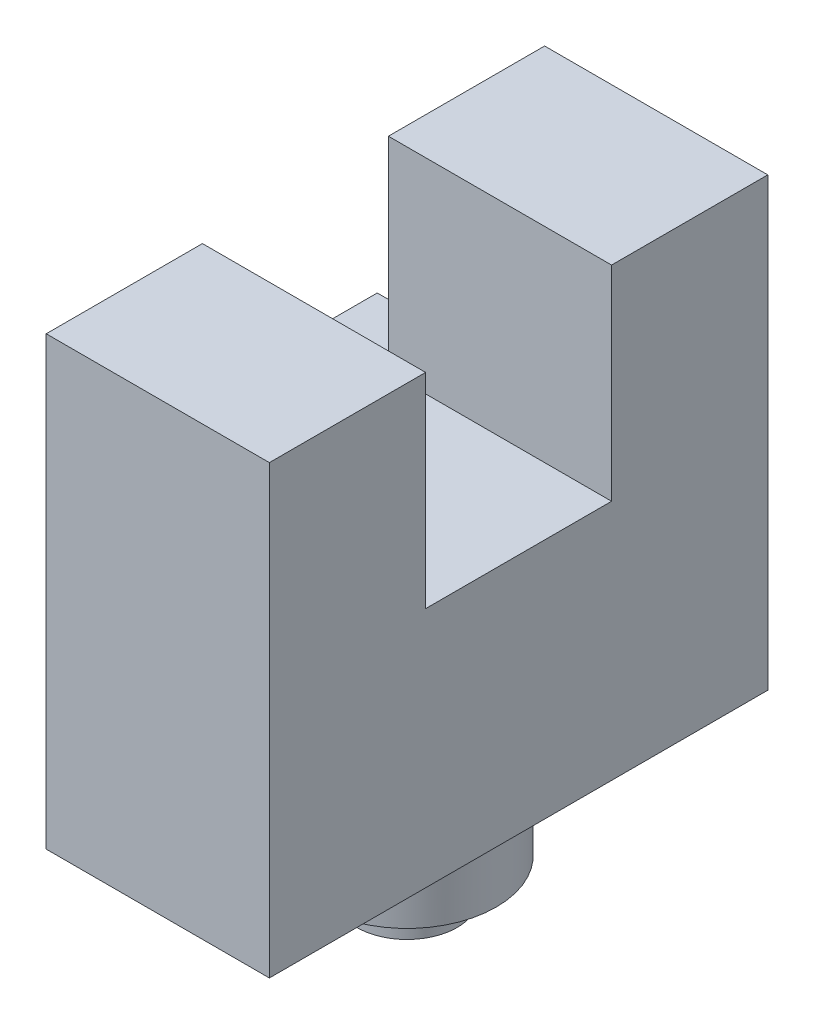
ISO-10303-21;
HEADER;
FILE_DESCRIPTION(('STEP AP214'),'2;1');
FILE_NAME('part.step','',(''),(''),'','','');
FILE_SCHEMA(('AUTOMOTIVE_DESIGN { 1 0 10303 214 1 1 1 1 }'));
ENDSEC;
DATA;
#1=APPLICATION_CONTEXT('core data for automotive mechanical design processes');
#2=APPLICATION_PROTOCOL_DEFINITION('international standard','automotive_design',2000,#1);
#3=PRODUCT_CONTEXT('',#1,'mechanical');
#4=PRODUCT('Part','Part','',(#3));
#5=PRODUCT_RELATED_PRODUCT_CATEGORY('part','',(#4));
#6=PRODUCT_DEFINITION_FORMATION('','',#4);
#7=PRODUCT_DEFINITION_CONTEXT('part definition',#1,'design');
#8=PRODUCT_DEFINITION('design','',#6,#7);
#9=PRODUCT_DEFINITION_SHAPE('','',#8);
#10=(LENGTH_UNIT() NAMED_UNIT(*) SI_UNIT(.MILLI.,.METRE.));
#11=(NAMED_UNIT(*) PLANE_ANGLE_UNIT() SI_UNIT($,.RADIAN.));
#12=(NAMED_UNIT(*) SI_UNIT($,.STERADIAN.) SOLID_ANGLE_UNIT());
#13=UNCERTAINTY_MEASURE_WITH_UNIT(LENGTH_MEASURE(1.E-05),#10,'distance_accuracy_value','');
#14=(GEOMETRIC_REPRESENTATION_CONTEXT(3) GLOBAL_UNCERTAINTY_ASSIGNED_CONTEXT((#13)) GLOBAL_UNIT_ASSIGNED_CONTEXT((#10,
#11,#12)) REPRESENTATION_CONTEXT('',''));
#15=CARTESIAN_POINT('',(0.,0.,0.));
#16=DIRECTION('',(0.,0.,1.));
#17=DIRECTION('',(1.,0.,0.));
#18=AXIS2_PLACEMENT_3D('',#15,#16,#17);
#19=CARTESIAN_POINT('',(0.,12.,-6.7));
#20=DIRECTION('',(0.,0.,-1.));
#21=DIRECTION('',(-1.,0.,0.));
#22=AXIS2_PLACEMENT_3D('',#19,#20,#21);
#23=PLANE('',#22);
#24=CARTESIAN_POINT('',(-2.5,2.,-6.7));
#25=DIRECTION('',(0.,0.,-1.));
#26=DIRECTION('',(-1.,0.,0.));
#27=AXIS2_PLACEMENT_3D('',#24,#25,#26);
#28=CIRCLE('',#27,1.25);
#29=CARTESIAN_POINT('',(-3.75,2.,-6.7));
#30=VERTEX_POINT('',#29);
#31=EDGE_CURVE('P0_E165',#30,#30,#28,.T.);
#32=ORIENTED_EDGE('',*,*,#31,.F.);
#33=EDGE_LOOP('',(#32));
#34=FACE_BOUND('',#33,.T.);
#35=DIRECTION('',(0.,-1.,0.));
#36=VECTOR('',#35,1.);
#37=CARTESIAN_POINT('',(0.,0.,-6.7));
#38=LINE('',#37,#36);
#39=CARTESIAN_POINT('',(0.,12.,-6.7));
#40=VERTEX_POINT('',#39);
#41=CARTESIAN_POINT('',(0.,4.,-6.7));
#42=VERTEX_POINT('',#41);
#43=EDGE_CURVE('P0_E321',#40,#42,#38,.T.);
#44=ORIENTED_EDGE('',*,*,#43,.F.);
#45=DIRECTION('',(-1.,0.,0.));
#46=VECTOR('',#45,1.);
#47=CARTESIAN_POINT('',(0.,12.,-6.7));
#48=LINE('',#47,#46);
#49=CARTESIAN_POINT('',(6.,12.,-6.7));
#50=VERTEX_POINT('',#49);
#51=EDGE_CURVE('P0_E336',#50,#40,#48,.T.);
#52=ORIENTED_EDGE('',*,*,#51,.F.);
#53=DIRECTION('',(0.,1.,0.));
#54=VECTOR('',#53,1.);
#55=CARTESIAN_POINT('',(6.,0.,-6.7));
#56=LINE('',#55,#54);
#57=CARTESIAN_POINT('',(6.,0.,-6.7));
#58=VERTEX_POINT('',#57);
#59=EDGE_CURVE('P0_E308',#58,#50,#56,.T.);
#60=ORIENTED_EDGE('',*,*,#59,.F.);
#61=DIRECTION('',(1.,0.,0.));
#62=VECTOR('',#61,1.);
#63=CARTESIAN_POINT('',(0.,0.,-6.7));
#64=LINE('',#63,#62);
#65=CARTESIAN_POINT('',(-4.5,0.,-6.7));
#66=VERTEX_POINT('',#65);
#67=EDGE_CURVE('P0_E343',#66,#58,#64,.T.);
#68=ORIENTED_EDGE('',*,*,#67,.F.);
#69=DIRECTION('',(0.,1.,0.));
#70=VECTOR('',#69,1.);
#71=CARTESIAN_POINT('',(-4.5,0.,-6.7));
#72=LINE('',#71,#70);
#73=CARTESIAN_POINT('',(-4.5,4.,-6.7));
#74=VERTEX_POINT('',#73);
#75=EDGE_CURVE('P0_E204',#66,#74,#72,.T.);
#76=ORIENTED_EDGE('',*,*,#75,.T.);
#77=DIRECTION('',(1.,0.,0.));
#78=VECTOR('',#77,1.);
#79=CARTESIAN_POINT('',(-4.5,4.,-6.7));
#80=LINE('',#79,#78);
#81=EDGE_CURVE('P0_E209',#74,#42,#80,.T.);
#82=ORIENTED_EDGE('',*,*,#81,.T.);
#83=EDGE_LOOP('',(#44,#52,#60,#68,#76,#82));
#84=FACE_BOUND('',#83,.T.);
#85=CARTESIAN_POINT('',(3.,2.,-6.7));
#86=DIRECTION('',(0.,0.,-1.));
#87=DIRECTION('',(-1.,0.,0.));
#88=AXIS2_PLACEMENT_3D('',#85,#86,#87);
#89=CIRCLE('',#88,1.);
#90=CARTESIAN_POINT('',(2.,2.,-6.7));
#91=VERTEX_POINT('',#90);
#92=EDGE_CURVE('P0_E168',#91,#91,#89,.T.);
#93=ORIENTED_EDGE('',*,*,#92,.F.);
#94=EDGE_LOOP('',(#93));
#95=FACE_BOUND('',#94,.T.);
#96=ADVANCED_FACE('P0_F17',(#34,#84,#95),#23,.T.);
#97=CARTESIAN_POINT('',(0.,12.,6.7));
#98=DIRECTION('',(0.,-1.,0.));
#99=DIRECTION('',(0.,0.,-1.));
#100=AXIS2_PLACEMENT_3D('',#97,#98,#99);
#101=PLANE('',#100);
#102=DIRECTION('',(0.,0.,-1.));
#103=VECTOR('',#102,1.);
#104=CARTESIAN_POINT('',(0.,12.,6.7));
#105=LINE('',#104,#103);
#106=CARTESIAN_POINT('',(0.,12.,-2.5));
#107=VERTEX_POINT('',#106);
#108=EDGE_CURVE('P0_E305',#107,#40,#105,.T.);
#109=ORIENTED_EDGE('',*,*,#108,.F.);
#110=DIRECTION('',(-1.,0.,0.));
#111=VECTOR('',#110,1.);
#112=CARTESIAN_POINT('',(6.,12.,-2.5));
#113=LINE('',#112,#111);
#114=CARTESIAN_POINT('',(6.,12.,-2.5));
#115=VERTEX_POINT('',#114);
#116=EDGE_CURVE('P0_E188',#115,#107,#113,.T.);
#117=ORIENTED_EDGE('',*,*,#116,.F.);
#118=DIRECTION('',(0.,0.,-1.));
#119=VECTOR('',#118,1.);
#120=CARTESIAN_POINT('',(6.,12.,6.7));
#121=LINE('',#120,#119);
#122=EDGE_CURVE('P0_E303',#115,#50,#121,.T.);
#123=ORIENTED_EDGE('',*,*,#122,.T.);
#124=ORIENTED_EDGE('',*,*,#51,.T.);
#125=EDGE_LOOP('',(#109,#117,#123,#124));
#126=FACE_BOUND('',#125,.T.);
#127=ADVANCED_FACE('P0_F256',(#126),#101,.F.);
#128=CARTESIAN_POINT('',(3.,-2.,0.));
#129=DIRECTION('',(0.,-1.,0.));
#130=DIRECTION('',(0.,0.,-1.));
#131=AXIS2_PLACEMENT_3D('',#128,#129,#130);
#132=PLANE('',#131);
#133=CARTESIAN_POINT('',(3.,-2.,0.));
#134=DIRECTION('',(0.,-1.,0.));
#135=DIRECTION('',(0.,0.,-1.));
#136=AXIS2_PLACEMENT_3D('',#133,#134,#135);
#137=CIRCLE('',#136,2.4);
#138=CARTESIAN_POINT('',(3.,-2.,-2.4));
#139=VERTEX_POINT('',#138);
#140=EDGE_CURVE('P0_E199',#139,#139,#137,.T.);
#141=ORIENTED_EDGE('',*,*,#140,.T.);
#142=EDGE_LOOP('',(#141));
#143=FACE_BOUND('',#142,.T.);
#144=CARTESIAN_POINT('',(3.,-2.,0.));
#145=DIRECTION('',(0.,-1.,0.));
#146=DIRECTION('',(0.,0.,-1.));
#147=AXIS2_PLACEMENT_3D('',#144,#145,#146);
#148=CIRCLE('',#147,1.35);
#149=CARTESIAN_POINT('',(3.,-2.,-1.35));
#150=VERTEX_POINT('',#149);
#151=EDGE_CURVE('P0_E190',#150,#150,#148,.T.);
#152=ORIENTED_EDGE('',*,*,#151,.F.);
#153=EDGE_LOOP('',(#152));
#154=FACE_BOUND('',#153,.T.);
#155=ADVANCED_FACE('P0_F263',(#143,#154),#132,.T.);
#156=CARTESIAN_POINT('',(0.,0.,6.7));
#157=DIRECTION('',(0.,1.,0.));
#158=DIRECTION('',(0.,0.,1.));
#159=AXIS2_PLACEMENT_3D('',#156,#157,#158);
#160=PLANE('',#159);
#161=ORIENTED_EDGE('',*,*,#67,.T.);
#162=DIRECTION('',(0.,0.,-1.));
#163=VECTOR('',#162,1.);
#164=CARTESIAN_POINT('',(6.,0.,6.7));
#165=LINE('',#164,#163);
#166=CARTESIAN_POINT('',(6.,0.,6.7));
#167=VERTEX_POINT('',#166);
#168=EDGE_CURVE('P0_E314',#167,#58,#165,.T.);
#169=ORIENTED_EDGE('',*,*,#168,.F.);
#170=DIRECTION('',(1.,0.,0.));
#171=VECTOR('',#170,1.);
#172=CARTESIAN_POINT('',(0.,0.,6.7));
#173=LINE('',#172,#171);
#174=CARTESIAN_POINT('',(0.,0.,6.7));
#175=VERTEX_POINT('',#174);
#176=EDGE_CURVE('P0_E335',#175,#167,#173,.T.);
#177=ORIENTED_EDGE('',*,*,#176,.F.);
#178=DIRECTION('',(0.,0.,-1.));
#179=VECTOR('',#178,1.);
#180=CARTESIAN_POINT('',(0.,0.,6.7));
#181=LINE('',#180,#179);
#182=CARTESIAN_POINT('',(0.,0.,-2.2));
#183=VERTEX_POINT('',#182);
#184=EDGE_CURVE('P0_E235',#175,#183,#181,.T.);
#185=ORIENTED_EDGE('',*,*,#184,.T.);
#186=DIRECTION('',(-1.,0.,0.));
#187=VECTOR('',#186,1.);
#188=CARTESIAN_POINT('',(-4.5,0.,-2.2));
#189=LINE('',#188,#187);
#190=CARTESIAN_POINT('',(-4.5,0.,-2.2));
#191=VERTEX_POINT('',#190);
#192=EDGE_CURVE('P0_E220',#183,#191,#189,.T.);
#193=ORIENTED_EDGE('',*,*,#192,.T.);
#194=DIRECTION('',(0.,0.,-1.));
#195=VECTOR('',#194,1.);
#196=CARTESIAN_POINT('',(-4.5,0.,-2.2));
#197=LINE('',#196,#195);
#198=EDGE_CURVE('P0_E225',#191,#66,#197,.T.);
#199=ORIENTED_EDGE('',*,*,#198,.T.);
#200=EDGE_LOOP('',(#161,#169,#177,#185,#193,#199));
#201=FACE_BOUND('',#200,.T.);
#202=CARTESIAN_POINT('',(3.,0.,0.));
#203=DIRECTION('',(0.,1.,0.));
#204=DIRECTION('',(0.,0.,1.));
#205=AXIS2_PLACEMENT_3D('',#202,#203,#204);
#206=CIRCLE('',#205,2.4);
#207=CARTESIAN_POINT('',(3.,0.,2.4));
#208=VERTEX_POINT('',#207);
#209=EDGE_CURVE('P0_E233',#208,#208,#206,.F.);
#210=ORIENTED_EDGE('',*,*,#209,.F.);
#211=EDGE_LOOP('',(#210));
#212=FACE_BOUND('',#211,.T.);
#213=ADVANCED_FACE('P0_F280',(#201,#212),#160,.F.);
#214=CARTESIAN_POINT('',(0.,0.,6.7));
#215=DIRECTION('',(1.,0.,0.));
#216=DIRECTION('',(0.,0.,-1.));
#217=AXIS2_PLACEMENT_3D('',#214,#215,#216);
#218=PLANE('',#217);
#219=DIRECTION('',(0.,0.,1.));
#220=VECTOR('',#219,1.);
#221=CARTESIAN_POINT('',(0.,4.5,0.));
#222=LINE('',#221,#220);
#223=CARTESIAN_POINT('',(0.,4.5,0.));
#224=VERTEX_POINT('',#223);
#225=CARTESIAN_POINT('',(0.,4.5,2.));
#226=VERTEX_POINT('',#225);
#227=EDGE_CURVE('P0_E153',#224,#226,#222,.T.);
#228=ORIENTED_EDGE('',*,*,#227,.F.);
#229=DIRECTION('',(0.,-1.,0.));
#230=VECTOR('',#229,1.);
#231=CARTESIAN_POINT('',(0.,5.3,0.));
#232=LINE('',#231,#230);
#233=CARTESIAN_POINT('',(0.,5.3,0.));
#234=VERTEX_POINT('',#233);
#235=EDGE_CURVE('P0_E32',#234,#224,#232,.T.);
#236=ORIENTED_EDGE('',*,*,#235,.F.);
#237=DIRECTION('',(0.,0.,-1.));
#238=VECTOR('',#237,1.);
#239=CARTESIAN_POINT('',(0.,5.3,0.));
#240=LINE('',#239,#238);
#241=CARTESIAN_POINT('',(0.,5.3,2.));
#242=VERTEX_POINT('',#241);
#243=EDGE_CURVE('P0_E144',#242,#234,#240,.T.);
#244=ORIENTED_EDGE('',*,*,#243,.F.);
#245=DIRECTION('',(0.,1.,0.));
#246=VECTOR('',#245,1.);
#247=CARTESIAN_POINT('',(0.,5.3,2.));
#248=LINE('',#247,#246);
#249=EDGE_CURVE('P0_E147',#226,#242,#248,.T.);
#250=ORIENTED_EDGE('',*,*,#249,.F.);
#251=EDGE_LOOP('',(#228,#236,#244,#250));
#252=FACE_BOUND('',#251,.T.);
#253=DIRECTION('',(0.,0.,1.));
#254=VECTOR('',#253,1.);
#255=CARTESIAN_POINT('',(0.,6.5,-2.5));
#256=LINE('',#255,#254);
#257=CARTESIAN_POINT('',(0.,6.5,-2.5));
#258=VERTEX_POINT('',#257);
#259=CARTESIAN_POINT('',(0.,6.5,2.5));
#260=VERTEX_POINT('',#259);
#261=EDGE_CURVE('P0_E184',#258,#260,#256,.T.);
#262=ORIENTED_EDGE('',*,*,#261,.F.);
#263=DIRECTION('',(0.,-1.,0.));
#264=VECTOR('',#263,1.);
#265=CARTESIAN_POINT('',(0.,12.,-2.5));
#266=LINE('',#265,#264);
#267=EDGE_CURVE('P0_E171',#107,#258,#266,.T.);
#268=ORIENTED_EDGE('',*,*,#267,.F.);
#269=ORIENTED_EDGE('',*,*,#108,.T.);
#270=ORIENTED_EDGE('',*,*,#43,.T.);
#271=DIRECTION('',(0.,0.,-1.));
#272=VECTOR('',#271,1.);
#273=CARTESIAN_POINT('',(0.,4.,-2.2));
#274=LINE('',#273,#272);
#275=CARTESIAN_POINT('',(0.,4.,-2.2));
#276=VERTEX_POINT('',#275);
#277=EDGE_CURVE('P0_E223',#276,#42,#274,.T.);
#278=ORIENTED_EDGE('',*,*,#277,.F.);
#279=DIRECTION('',(0.,-1.,0.));
#280=VECTOR('',#279,1.);
#281=CARTESIAN_POINT('',(0.,0.,-2.2));
#282=LINE('',#281,#280);
#283=EDGE_CURVE('P0_E212',#276,#183,#282,.T.);
#284=ORIENTED_EDGE('',*,*,#283,.T.);
#285=ORIENTED_EDGE('',*,*,#184,.F.);
#286=DIRECTION('',(0.,-1.,0.));
#287=VECTOR('',#286,1.);
#288=CARTESIAN_POINT('',(0.,0.,6.7));
#289=LINE('',#288,#287);
#290=CARTESIAN_POINT('',(0.,12.,6.7));
#291=VERTEX_POINT('',#290);
#292=EDGE_CURVE('P0_E332',#291,#175,#289,.T.);
#293=ORIENTED_EDGE('',*,*,#292,.F.);
#294=CARTESIAN_POINT('',(0.,12.,2.5));
#295=VERTEX_POINT('',#294);
#296=EDGE_CURVE('P0_E311',#291,#295,#105,.T.);
#297=ORIENTED_EDGE('',*,*,#296,.T.);
#298=DIRECTION('',(0.,1.,0.));
#299=VECTOR('',#298,1.);
#300=CARTESIAN_POINT('',(0.,12.,2.5));
#301=LINE('',#300,#299);
#302=EDGE_CURVE('P0_E40',#260,#295,#301,.T.);
#303=ORIENTED_EDGE('',*,*,#302,.F.);
#304=EDGE_LOOP('',(#262,#268,#269,#270,#278,#284,#285,#293,#297,#303));
#305=FACE_BOUND('',#304,.T.);
#306=ADVANCED_FACE('P0_F278',(#252,#305),#218,.F.);
#307=CARTESIAN_POINT('',(6.,0.,6.7));
#308=DIRECTION('',(-1.,0.,0.));
#309=DIRECTION('',(0.,0.,1.));
#310=AXIS2_PLACEMENT_3D('',#307,#308,#309);
#311=PLANE('',#310);
#312=ORIENTED_EDGE('',*,*,#122,.F.);
#313=DIRECTION('',(0.,-1.,0.));
#314=VECTOR('',#313,1.);
#315=CARTESIAN_POINT('',(6.,12.,-2.5));
#316=LINE('',#315,#314);
#317=CARTESIAN_POINT('',(6.,6.5,-2.5));
#318=VERTEX_POINT('',#317);
#319=EDGE_CURVE('P0_E172',#115,#318,#316,.T.);
#320=ORIENTED_EDGE('',*,*,#319,.T.);
#321=DIRECTION('',(0.,0.,1.));
#322=VECTOR('',#321,1.);
#323=CARTESIAN_POINT('',(6.,6.5,-2.5));
#324=LINE('',#323,#322);
#325=CARTESIAN_POINT('',(6.,6.5,2.5));
#326=VERTEX_POINT('',#325);
#327=EDGE_CURVE('P0_E175',#318,#326,#324,.T.);
#328=ORIENTED_EDGE('',*,*,#327,.T.);
#329=DIRECTION('',(0.,1.,0.));
#330=VECTOR('',#329,1.);
#331=CARTESIAN_POINT('',(6.,12.,2.5));
#332=LINE('',#331,#330);
#333=CARTESIAN_POINT('',(6.,12.,2.5));
#334=VERTEX_POINT('',#333);
#335=EDGE_CURVE('P0_E178',#326,#334,#332,.T.);
#336=ORIENTED_EDGE('',*,*,#335,.T.);
#337=CARTESIAN_POINT('',(6.,12.,6.7));
#338=VERTEX_POINT('',#337);
#339=EDGE_CURVE('P0_E310',#338,#334,#121,.T.);
#340=ORIENTED_EDGE('',*,*,#339,.F.);
#341=DIRECTION('',(0.,1.,0.));
#342=VECTOR('',#341,1.);
#343=CARTESIAN_POINT('',(6.,0.,6.7));
#344=LINE('',#343,#342);
#345=EDGE_CURVE('P0_E338',#167,#338,#344,.T.);
#346=ORIENTED_EDGE('',*,*,#345,.F.);
#347=ORIENTED_EDGE('',*,*,#168,.T.);
#348=ORIENTED_EDGE('',*,*,#59,.T.);
#349=EDGE_LOOP('',(#312,#320,#328,#336,#340,#346,#347,#348));
#350=FACE_BOUND('',#349,.T.);
#351=ADVANCED_FACE('P0_F274',(#350),#311,.F.);
#352=ORIENTED_EDGE('',*,*,#339,.T.);
#353=DIRECTION('',(-1.,0.,0.));
#354=VECTOR('',#353,1.);
#355=CARTESIAN_POINT('',(6.,12.,2.5));
#356=LINE('',#355,#354);
#357=EDGE_CURVE('P0_E191',#334,#295,#356,.T.);
#358=ORIENTED_EDGE('',*,*,#357,.T.);
#359=ORIENTED_EDGE('',*,*,#296,.F.);
#360=DIRECTION('',(-1.,0.,0.));
#361=VECTOR('',#360,1.);
#362=CARTESIAN_POINT('',(0.,12.,6.7));
#363=LINE('',#362,#361);
#364=EDGE_CURVE('P0_E340',#338,#291,#363,.T.);
#365=ORIENTED_EDGE('',*,*,#364,.F.);
#366=EDGE_LOOP('',(#352,#358,#359,#365));
#367=FACE_BOUND('',#366,.T.);
#368=ADVANCED_FACE('P0_F266',(#367),#101,.F.);
#369=CARTESIAN_POINT('',(0.,12.,6.7));
#370=DIRECTION('',(0.,0.,-1.));
#371=DIRECTION('',(-1.,0.,0.));
#372=AXIS2_PLACEMENT_3D('',#369,#370,#371);
#373=PLANE('',#372);
#374=ORIENTED_EDGE('',*,*,#292,.T.);
#375=ORIENTED_EDGE('',*,*,#176,.T.);
#376=ORIENTED_EDGE('',*,*,#345,.T.);
#377=ORIENTED_EDGE('',*,*,#364,.T.);
#378=EDGE_LOOP('',(#374,#375,#376,#377));
#379=FACE_BOUND('',#378,.T.);
#380=ADVANCED_FACE('P0_F270',(#379),#373,.F.);
#381=CARTESIAN_POINT('',(-4.5,0.,-2.2));
#382=DIRECTION('',(-1.,0.,0.));
#383=DIRECTION('',(0.,0.,1.));
#384=AXIS2_PLACEMENT_3D('',#381,#382,#383);
#385=PLANE('',#384);
#386=ORIENTED_EDGE('',*,*,#75,.F.);
#387=ORIENTED_EDGE('',*,*,#198,.F.);
#388=DIRECTION('',(0.,1.,0.));
#389=VECTOR('',#388,1.);
#390=CARTESIAN_POINT('',(-4.5,0.,-2.2));
#391=LINE('',#390,#389);
#392=CARTESIAN_POINT('',(-4.5,4.,-2.2));
#393=VERTEX_POINT('',#392);
#394=EDGE_CURVE('P0_E205',#191,#393,#391,.T.);
#395=ORIENTED_EDGE('',*,*,#394,.T.);
#396=DIRECTION('',(0.,0.,-1.));
#397=VECTOR('',#396,1.);
#398=CARTESIAN_POINT('',(-4.5,4.,-2.2));
#399=LINE('',#398,#397);
#400=EDGE_CURVE('P0_E226',#393,#74,#399,.T.);
#401=ORIENTED_EDGE('',*,*,#400,.T.);
#402=EDGE_LOOP('',(#386,#387,#395,#401));
#403=FACE_BOUND('',#402,.T.);
#404=ADVANCED_FACE('P0_F353',(#403),#385,.T.);
#405=CARTESIAN_POINT('',(-4.5,4.,-2.2));
#406=DIRECTION('',(0.,1.,0.));
#407=DIRECTION('',(-1.,0.,0.));
#408=AXIS2_PLACEMENT_3D('',#405,#406,#407);
#409=PLANE('',#408);
#410=ORIENTED_EDGE('',*,*,#81,.F.);
#411=ORIENTED_EDGE('',*,*,#400,.F.);
#412=DIRECTION('',(1.,0.,0.));
#413=VECTOR('',#412,1.);
#414=CARTESIAN_POINT('',(-4.5,4.,-2.2));
#415=LINE('',#414,#413);
#416=EDGE_CURVE('P0_E208',#393,#276,#415,.T.);
#417=ORIENTED_EDGE('',*,*,#416,.T.);
#418=ORIENTED_EDGE('',*,*,#277,.T.);
#419=EDGE_LOOP('',(#410,#411,#417,#418));
#420=FACE_BOUND('',#419,.T.);
#421=ADVANCED_FACE('P0_F355',(#420),#409,.T.);
#422=CARTESIAN_POINT('',(-4.5,4.,-2.2));
#423=DIRECTION('',(0.,0.,-1.));
#424=DIRECTION('',(-1.,0.,0.));
#425=AXIS2_PLACEMENT_3D('',#422,#423,#424);
#426=PLANE('',#425);
#427=CARTESIAN_POINT('',(-2.5,2.,-2.2));
#428=DIRECTION('',(0.,0.,1.));
#429=DIRECTION('',(1.,0.,0.));
#430=AXIS2_PLACEMENT_3D('',#427,#428,#429);
#431=CIRCLE('',#430,1.25);
#432=CARTESIAN_POINT('',(-1.25,2.,-2.2));
#433=VERTEX_POINT('',#432);
#434=EDGE_CURVE('P0_E159',#433,#433,#431,.T.);
#435=ORIENTED_EDGE('',*,*,#434,.F.);
#436=EDGE_LOOP('',(#435));
#437=FACE_BOUND('',#436,.T.);
#438=ORIENTED_EDGE('',*,*,#394,.F.);
#439=ORIENTED_EDGE('',*,*,#192,.F.);
#440=ORIENTED_EDGE('',*,*,#283,.F.);
#441=ORIENTED_EDGE('',*,*,#416,.F.);
#442=EDGE_LOOP('',(#438,#439,#440,#441));
#443=FACE_BOUND('',#442,.T.);
#444=ADVANCED_FACE('P0_F361',(#437,#443),#426,.F.);
#445=CARTESIAN_POINT('',(3.,-2.,0.));
#446=DIRECTION('',(0.,1.,0.));
#447=DIRECTION('',(0.,0.,1.));
#448=AXIS2_PLACEMENT_3D('',#445,#446,#447);
#449=CYLINDRICAL_SURFACE('',#448,2.4);
#450=ORIENTED_EDGE('',*,*,#140,.F.);
#451=EDGE_LOOP('',(#450));
#452=FACE_BOUND('',#451,.T.);
#453=ORIENTED_EDGE('',*,*,#209,.T.);
#454=EDGE_LOOP('',(#453));
#455=FACE_BOUND('',#454,.T.);
#456=ADVANCED_FACE('P0_F368',(#452,#455),#449,.T.);
#457=CARTESIAN_POINT('',(3.,-3.,0.));
#458=DIRECTION('',(0.,1.,0.));
#459=DIRECTION('',(0.,0.,1.));
#460=AXIS2_PLACEMENT_3D('',#457,#458,#459);
#461=CYLINDRICAL_SURFACE('',#460,1.35);
#462=CARTESIAN_POINT('',(3.,-3.,0.));
#463=DIRECTION('',(0.,-1.,0.));
#464=DIRECTION('',(0.,0.,-1.));
#465=AXIS2_PLACEMENT_3D('',#462,#463,#464);
#466=CIRCLE('',#465,1.35);
#467=CARTESIAN_POINT('',(3.,-3.,-1.35));
#468=VERTEX_POINT('',#467);
#469=EDGE_CURVE('P0_E196',#468,#468,#466,.T.);
#470=ORIENTED_EDGE('',*,*,#469,.F.);
#471=EDGE_LOOP('',(#470));
#472=FACE_BOUND('',#471,.T.);
#473=ORIENTED_EDGE('',*,*,#151,.T.);
#474=EDGE_LOOP('',(#473));
#475=FACE_BOUND('',#474,.T.);
#476=ADVANCED_FACE('P0_F372',(#472,#475),#461,.T.);
#477=CARTESIAN_POINT('',(3.,-3.,0.));
#478=DIRECTION('',(0.,-1.,0.));
#479=DIRECTION('',(0.,0.,-1.));
#480=AXIS2_PLACEMENT_3D('',#477,#478,#479);
#481=PLANE('',#480);
#482=ORIENTED_EDGE('',*,*,#469,.T.);
#483=EDGE_LOOP('',(#482));
#484=FACE_BOUND('',#483,.T.);
#485=ADVANCED_FACE('P0_F379',(#484),#481,.T.);
#486=CARTESIAN_POINT('',(6.,12.,-2.5));
#487=DIRECTION('',(0.,0.,-1.));
#488=DIRECTION('',(0.,1.,0.));
#489=AXIS2_PLACEMENT_3D('',#486,#487,#488);
#490=PLANE('',#489);
#491=ORIENTED_EDGE('',*,*,#267,.T.);
#492=DIRECTION('',(-1.,0.,0.));
#493=VECTOR('',#492,1.);
#494=CARTESIAN_POINT('',(6.,6.5,-2.5));
#495=LINE('',#494,#493);
#496=EDGE_CURVE('P0_E181',#318,#258,#495,.T.);
#497=ORIENTED_EDGE('',*,*,#496,.F.);
#498=ORIENTED_EDGE('',*,*,#319,.F.);
#499=ORIENTED_EDGE('',*,*,#116,.T.);
#500=EDGE_LOOP('',(#491,#497,#498,#499));
#501=FACE_BOUND('',#500,.T.);
#502=ADVANCED_FACE('P0_F299',(#501),#490,.F.);
#503=CARTESIAN_POINT('',(6.,12.,2.5));
#504=DIRECTION('',(0.,0.,1.));
#505=DIRECTION('',(0.,-1.,0.));
#506=AXIS2_PLACEMENT_3D('',#503,#504,#505);
#507=PLANE('',#506);
#508=ORIENTED_EDGE('',*,*,#302,.T.);
#509=ORIENTED_EDGE('',*,*,#357,.F.);
#510=ORIENTED_EDGE('',*,*,#335,.F.);
#511=DIRECTION('',(-1.,0.,0.));
#512=VECTOR('',#511,1.);
#513=CARTESIAN_POINT('',(6.,6.5,2.5));
#514=LINE('',#513,#512);
#515=EDGE_CURVE('P0_E193',#326,#260,#514,.T.);
#516=ORIENTED_EDGE('',*,*,#515,.T.);
#517=EDGE_LOOP('',(#508,#509,#510,#516));
#518=FACE_BOUND('',#517,.T.);
#519=ADVANCED_FACE('P0_F386',(#518),#507,.F.);
#520=CARTESIAN_POINT('',(6.,6.5,-2.5));
#521=DIRECTION('',(0.,-1.,0.));
#522=DIRECTION('',(0.,0.,-1.));
#523=AXIS2_PLACEMENT_3D('',#520,#521,#522);
#524=PLANE('',#523);
#525=ORIENTED_EDGE('',*,*,#261,.T.);
#526=ORIENTED_EDGE('',*,*,#515,.F.);
#527=ORIENTED_EDGE('',*,*,#327,.F.);
#528=ORIENTED_EDGE('',*,*,#496,.T.);
#529=EDGE_LOOP('',(#525,#526,#527,#528));
#530=FACE_BOUND('',#529,.T.);
#531=ADVANCED_FACE('P0_F295',(#530),#524,.F.);
#532=CARTESIAN_POINT('',(3.,2.,-8.2));
#533=DIRECTION('',(0.,0.,1.));
#534=DIRECTION('',(1.,0.,0.));
#535=AXIS2_PLACEMENT_3D('',#532,#533,#534);
#536=CYLINDRICAL_SURFACE('',#535,1.);
#537=CARTESIAN_POINT('',(3.,2.,-7.7));
#538=DIRECTION('',(0.,0.,-1.));
#539=DIRECTION('',(-1.,0.,0.));
#540=AXIS2_PLACEMENT_3D('',#537,#538,#539);
#541=CIRCLE('',#540,1.);
#542=CARTESIAN_POINT('',(2.,2.,-7.7));
#543=VERTEX_POINT('',#542);
#544=EDGE_CURVE('P0_E11',#543,#543,#541,.F.);
#545=ORIENTED_EDGE('',*,*,#544,.T.);
#546=EDGE_LOOP('',(#545));
#547=FACE_BOUND('',#546,.T.);
#548=ORIENTED_EDGE('',*,*,#92,.T.);
#549=EDGE_LOOP('',(#548));
#550=FACE_BOUND('',#549,.T.);
#551=ADVANCED_FACE('P0_F252',(#547,#550),#536,.T.);
#552=CARTESIAN_POINT('',(3.,2.,-8.2));
#553=DIRECTION('',(0.,0.,-1.));
#554=DIRECTION('',(-1.,0.,0.));
#555=AXIS2_PLACEMENT_3D('',#552,#553,#554);
#556=PLANE('',#555);
#557=CARTESIAN_POINT('',(3.,2.,-8.2));
#558=DIRECTION('',(0.,0.,-1.));
#559=DIRECTION('',(-1.,0.,0.));
#560=AXIS2_PLACEMENT_3D('',#557,#558,#559);
#561=CIRCLE('',#560,0.5);
#562=CARTESIAN_POINT('',(2.5,2.,-8.2));
#563=VERTEX_POINT('',#562);
#564=EDGE_CURVE('P0_E25',#563,#563,#561,.T.);
#565=ORIENTED_EDGE('',*,*,#564,.T.);
#566=EDGE_LOOP('',(#565));
#567=FACE_BOUND('',#566,.T.);
#568=ADVANCED_FACE('P0_F239',(#567),#556,.T.);
#569=CARTESIAN_POINT('',(3.,2.,-8.2));
#570=DIRECTION('',(0.,0.,1.));
#571=DIRECTION('',(1.,0.,0.));
#572=AXIS2_PLACEMENT_3D('',#569,#570,#571);
#573=CONICAL_SURFACE('',#572,0.5,0.785398163397445);
#574=ORIENTED_EDGE('',*,*,#544,.F.);
#575=EDGE_LOOP('',(#574));
#576=FACE_BOUND('',#575,.T.);
#577=ORIENTED_EDGE('',*,*,#564,.F.);
#578=EDGE_LOOP('',(#577));
#579=FACE_BOUND('',#578,.T.);
#580=ADVANCED_FACE('P0_F19',(#576,#579),#573,.T.);
#581=CARTESIAN_POINT('',(-2.5,2.,-8.2));
#582=DIRECTION('',(0.,0.,1.));
#583=DIRECTION('',(1.,0.,0.));
#584=AXIS2_PLACEMENT_3D('',#581,#582,#583);
#585=CYLINDRICAL_SURFACE('',#584,1.25);
#586=ORIENTED_EDGE('',*,*,#31,.T.);
#587=EDGE_LOOP('',(#586));
#588=FACE_BOUND('',#587,.T.);
#589=ORIENTED_EDGE('',*,*,#434,.T.);
#590=EDGE_LOOP('',(#589));
#591=FACE_BOUND('',#590,.T.);
#592=ADVANCED_FACE('P0_F242',(#588,#591),#585,.F.);
#593=CARTESIAN_POINT('',(1.,5.3,0.));
#594=DIRECTION('',(0.,0.,-1.));
#595=DIRECTION('',(0.,1.,0.));
#596=AXIS2_PLACEMENT_3D('',#593,#594,#595);
#597=PLANE('',#596);
#598=ORIENTED_EDGE('',*,*,#235,.T.);
#599=DIRECTION('',(-1.,0.,0.));
#600=VECTOR('',#599,1.);
#601=CARTESIAN_POINT('',(1.,4.5,0.));
#602=LINE('',#601,#600);
#603=CARTESIAN_POINT('',(1.,4.5,0.));
#604=VERTEX_POINT('',#603);
#605=EDGE_CURVE('P0_E122',#604,#224,#602,.T.);
#606=ORIENTED_EDGE('',*,*,#605,.F.);
#607=DIRECTION('',(0.,-1.,0.));
#608=VECTOR('',#607,1.);
#609=CARTESIAN_POINT('',(1.,5.3,0.));
#610=LINE('',#609,#608);
#611=CARTESIAN_POINT('',(1.,5.3,0.));
#612=VERTEX_POINT('',#611);
#613=EDGE_CURVE('P0_E126',#612,#604,#610,.T.);
#614=ORIENTED_EDGE('',*,*,#613,.F.);
#615=DIRECTION('',(-1.,0.,0.));
#616=VECTOR('',#615,1.);
#617=CARTESIAN_POINT('',(1.,5.3,0.));
#618=LINE('',#617,#616);
#619=EDGE_CURVE('P0_E157',#612,#234,#618,.T.);
#620=ORIENTED_EDGE('',*,*,#619,.T.);
#621=EDGE_LOOP('',(#598,#606,#614,#620));
#622=FACE_BOUND('',#621,.T.);
#623=ADVANCED_FACE('P0_F124',(#622),#597,.F.);
#624=CARTESIAN_POINT('',(1.,5.3,0.));
#625=DIRECTION('',(0.,1.,0.));
#626=DIRECTION('',(0.,0.,1.));
#627=AXIS2_PLACEMENT_3D('',#624,#625,#626);
#628=PLANE('',#627);
#629=ORIENTED_EDGE('',*,*,#243,.T.);
#630=ORIENTED_EDGE('',*,*,#619,.F.);
#631=DIRECTION('',(0.,0.,-1.));
#632=VECTOR('',#631,1.);
#633=CARTESIAN_POINT('',(1.,5.3,0.));
#634=LINE('',#633,#632);
#635=CARTESIAN_POINT('',(1.,5.3,2.));
#636=VERTEX_POINT('',#635);
#637=EDGE_CURVE('P0_E132',#636,#612,#634,.T.);
#638=ORIENTED_EDGE('',*,*,#637,.F.);
#639=DIRECTION('',(-1.,0.,0.));
#640=VECTOR('',#639,1.);
#641=CARTESIAN_POINT('',(1.,5.3,2.));
#642=LINE('',#641,#640);
#643=EDGE_CURVE('P0_E160',#636,#242,#642,.T.);
#644=ORIENTED_EDGE('',*,*,#643,.T.);
#645=EDGE_LOOP('',(#629,#630,#638,#644));
#646=FACE_BOUND('',#645,.T.);
#647=ADVANCED_FACE('P0_F396',(#646),#628,.F.);
#648=CARTESIAN_POINT('',(1.,5.3,2.));
#649=DIRECTION('',(0.,0.,1.));
#650=DIRECTION('',(1.,0.,0.));
#651=AXIS2_PLACEMENT_3D('',#648,#649,#650);
#652=PLANE('',#651);
#653=ORIENTED_EDGE('',*,*,#249,.T.);
#654=ORIENTED_EDGE('',*,*,#643,.F.);
#655=DIRECTION('',(0.,1.,0.));
#656=VECTOR('',#655,1.);
#657=CARTESIAN_POINT('',(1.,5.3,2.));
#658=LINE('',#657,#656);
#659=CARTESIAN_POINT('',(1.,4.5,2.));
#660=VERTEX_POINT('',#659);
#661=EDGE_CURVE('P0_E140',#660,#636,#658,.T.);
#662=ORIENTED_EDGE('',*,*,#661,.F.);
#663=DIRECTION('',(-1.,0.,0.));
#664=VECTOR('',#663,1.);
#665=CARTESIAN_POINT('',(1.,4.5,2.));
#666=LINE('',#665,#664);
#667=EDGE_CURVE('P0_E131',#660,#226,#666,.T.);
#668=ORIENTED_EDGE('',*,*,#667,.T.);
#669=EDGE_LOOP('',(#653,#654,#662,#668));
#670=FACE_BOUND('',#669,.T.);
#671=ADVANCED_FACE('P0_F399',(#670),#652,.F.);
#672=CARTESIAN_POINT('',(1.,4.5,0.));
#673=DIRECTION('',(0.,-1.,0.));
#674=DIRECTION('',(0.,0.,-1.));
#675=AXIS2_PLACEMENT_3D('',#672,#673,#674);
#676=PLANE('',#675);
#677=ORIENTED_EDGE('',*,*,#227,.T.);
#678=ORIENTED_EDGE('',*,*,#667,.F.);
#679=DIRECTION('',(0.,0.,1.));
#680=VECTOR('',#679,1.);
#681=CARTESIAN_POINT('',(1.,4.5,0.));
#682=LINE('',#681,#680);
#683=EDGE_CURVE('P0_E135',#604,#660,#682,.T.);
#684=ORIENTED_EDGE('',*,*,#683,.F.);
#685=ORIENTED_EDGE('',*,*,#605,.T.);
#686=EDGE_LOOP('',(#677,#678,#684,#685));
#687=FACE_BOUND('',#686,.T.);
#688=ADVANCED_FACE('P0_F136',(#687),#676,.F.);
#689=CARTESIAN_POINT('',(1.,4.5,0.));
#690=DIRECTION('',(-1.,0.,0.));
#691=DIRECTION('',(0.,0.,1.));
#692=AXIS2_PLACEMENT_3D('',#689,#690,#691);
#693=PLANE('',#692);
#694=ORIENTED_EDGE('',*,*,#613,.T.);
#695=ORIENTED_EDGE('',*,*,#683,.T.);
#696=ORIENTED_EDGE('',*,*,#661,.T.);
#697=ORIENTED_EDGE('',*,*,#637,.T.);
#698=EDGE_LOOP('',(#694,#695,#696,#697));
#699=FACE_BOUND('',#698,.T.);
#700=ADVANCED_FACE('P0_F142',(#699),#693,.T.);
#701=CLOSED_SHELL('',(#96,#127,#155,#213,#306,#351,#368,#380,#404,#421,#444,#456,#476,#485,#502,
#519,#531,#551,#568,#580,#592,#623,#647,#671,#688,#700));
#702=MANIFOLD_SOLID_BREP('P0_B1',#701);
#703=CARTESIAN_POINT('',(0.,5.3,2.));
#704=DIRECTION('',(0.,-1.,0.));
#705=DIRECTION('',(0.,0.,-1.));
#706=AXIS2_PLACEMENT_3D('',#703,#704,#705);
#707=PLANE('',#706);
#708=DIRECTION('',(0.,0.,-1.));
#709=VECTOR('',#708,1.);
#710=CARTESIAN_POINT('',(1.,5.3,2.));
#711=LINE('',#710,#709);
#712=CARTESIAN_POINT('',(1.,5.3,2.));
#713=VERTEX_POINT('',#712);
#714=CARTESIAN_POINT('',(1.,5.3,0.));
#715=VERTEX_POINT('',#714);
#716=EDGE_CURVE('P1_E80',#713,#715,#711,.T.);
#717=ORIENTED_EDGE('',*,*,#716,.T.);
#718=DIRECTION('',(1.,0.,0.));
#719=VECTOR('',#718,1.);
#720=CARTESIAN_POINT('',(0.,5.3,0.));
#721=LINE('',#720,#719);
#722=CARTESIAN_POINT('',(0.,5.3,0.));
#723=VERTEX_POINT('',#722);
#724=EDGE_CURVE('P1_E11',#723,#715,#721,.T.);
#725=ORIENTED_EDGE('',*,*,#724,.F.);
#726=DIRECTION('',(0.,0.,-1.));
#727=VECTOR('',#726,1.);
#728=CARTESIAN_POINT('',(0.,5.3,2.));
#729=LINE('',#728,#727);
#730=CARTESIAN_POINT('',(0.,5.3,2.));
#731=VERTEX_POINT('',#730);
#732=EDGE_CURVE('P1_E68',#731,#723,#729,.T.);
#733=ORIENTED_EDGE('',*,*,#732,.F.);
#734=DIRECTION('',(1.,0.,0.));
#735=VECTOR('',#734,1.);
#736=CARTESIAN_POINT('',(0.,5.3,2.));
#737=LINE('',#736,#735);
#738=EDGE_CURVE('P1_E76',#731,#713,#737,.T.);
#739=ORIENTED_EDGE('',*,*,#738,.T.);
#740=EDGE_LOOP('',(#717,#725,#733,#739));
#741=FACE_BOUND('',#740,.T.);
#742=ADVANCED_FACE('P1_F17',(#741),#707,.F.);
#743=CARTESIAN_POINT('',(0.,5.3,0.));
#744=DIRECTION('',(0.,0.,1.));
#745=DIRECTION('',(0.,-1.,0.));
#746=AXIS2_PLACEMENT_3D('',#743,#744,#745);
#747=PLANE('',#746);
#748=DIRECTION('',(0.,-1.,0.));
#749=VECTOR('',#748,1.);
#750=CARTESIAN_POINT('',(1.,5.3,0.));
#751=LINE('',#750,#749);
#752=CARTESIAN_POINT('',(1.,4.5,0.));
#753=VERTEX_POINT('',#752);
#754=EDGE_CURVE('P1_E72',#715,#753,#751,.T.);
#755=ORIENTED_EDGE('',*,*,#754,.T.);
#756=DIRECTION('',(1.,0.,0.));
#757=VECTOR('',#756,1.);
#758=CARTESIAN_POINT('',(0.,4.5,0.));
#759=LINE('',#758,#757);
#760=CARTESIAN_POINT('',(0.,4.5,0.));
#761=VERTEX_POINT('',#760);
#762=EDGE_CURVE('P1_E25',#761,#753,#759,.T.);
#763=ORIENTED_EDGE('',*,*,#762,.F.);
#764=DIRECTION('',(0.,-1.,0.));
#765=VECTOR('',#764,1.);
#766=CARTESIAN_POINT('',(0.,5.3,0.));
#767=LINE('',#766,#765);
#768=EDGE_CURVE('P1_E63',#723,#761,#767,.T.);
#769=ORIENTED_EDGE('',*,*,#768,.F.);
#770=ORIENTED_EDGE('',*,*,#724,.T.);
#771=EDGE_LOOP('',(#755,#763,#769,#770));
#772=FACE_BOUND('',#771,.T.);
#773=ADVANCED_FACE('P1_F71',(#772),#747,.F.);
#774=CARTESIAN_POINT('',(0.,4.5,0.));
#775=DIRECTION('',(0.,1.,0.));
#776=DIRECTION('',(0.,0.,1.));
#777=AXIS2_PLACEMENT_3D('',#774,#775,#776);
#778=PLANE('',#777);
#779=DIRECTION('',(0.,0.,1.));
#780=VECTOR('',#779,1.);
#781=CARTESIAN_POINT('',(1.,4.5,0.));
#782=LINE('',#781,#780);
#783=CARTESIAN_POINT('',(1.,4.5,2.));
#784=VERTEX_POINT('',#783);
#785=EDGE_CURVE('P1_E50',#753,#784,#782,.T.);
#786=ORIENTED_EDGE('',*,*,#785,.T.);
#787=DIRECTION('',(1.,0.,0.));
#788=VECTOR('',#787,1.);
#789=CARTESIAN_POINT('',(0.,4.5,2.));
#790=LINE('',#789,#788);
#791=CARTESIAN_POINT('',(0.,4.5,2.));
#792=VERTEX_POINT('',#791);
#793=EDGE_CURVE('P1_E73',#792,#784,#790,.T.);
#794=ORIENTED_EDGE('',*,*,#793,.F.);
#795=DIRECTION('',(0.,0.,1.));
#796=VECTOR('',#795,1.);
#797=CARTESIAN_POINT('',(0.,4.5,0.));
#798=LINE('',#797,#796);
#799=EDGE_CURVE('P1_E66',#761,#792,#798,.T.);
#800=ORIENTED_EDGE('',*,*,#799,.F.);
#801=ORIENTED_EDGE('',*,*,#762,.T.);
#802=EDGE_LOOP('',(#786,#794,#800,#801));
#803=FACE_BOUND('',#802,.T.);
#804=ADVANCED_FACE('P1_F74',(#803),#778,.F.);
#805=CARTESIAN_POINT('',(0.,4.5,2.));
#806=DIRECTION('',(0.,0.,-1.));
#807=DIRECTION('',(-1.,0.,0.));
#808=AXIS2_PLACEMENT_3D('',#805,#806,#807);
#809=PLANE('',#808);
#810=DIRECTION('',(0.,1.,0.));
#811=VECTOR('',#810,1.);
#812=CARTESIAN_POINT('',(1.,4.5,2.));
#813=LINE('',#812,#811);
#814=EDGE_CURVE('P1_E56',#784,#713,#813,.T.);
#815=ORIENTED_EDGE('',*,*,#814,.T.);
#816=ORIENTED_EDGE('',*,*,#738,.F.);
#817=DIRECTION('',(0.,1.,0.));
#818=VECTOR('',#817,1.);
#819=CARTESIAN_POINT('',(0.,4.5,2.));
#820=LINE('',#819,#818);
#821=EDGE_CURVE('P1_E33',#792,#731,#820,.T.);
#822=ORIENTED_EDGE('',*,*,#821,.F.);
#823=ORIENTED_EDGE('',*,*,#793,.T.);
#824=EDGE_LOOP('',(#815,#816,#822,#823));
#825=FACE_BOUND('',#824,.T.);
#826=ADVANCED_FACE('P1_F87',(#825),#809,.F.);
#827=CARTESIAN_POINT('',(0.,5.3,0.));
#828=DIRECTION('',(-1.,0.,0.));
#829=DIRECTION('',(0.,0.,1.));
#830=AXIS2_PLACEMENT_3D('',#827,#828,#829);
#831=PLANE('',#830);
#832=ORIENTED_EDGE('',*,*,#732,.T.);
#833=ORIENTED_EDGE('',*,*,#768,.T.);
#834=ORIENTED_EDGE('',*,*,#799,.T.);
#835=ORIENTED_EDGE('',*,*,#821,.T.);
#836=EDGE_LOOP('',(#832,#833,#834,#835));
#837=FACE_BOUND('',#836,.T.);
#838=ADVANCED_FACE('P1_F64',(#837),#831,.T.);
#839=CARTESIAN_POINT('',(1.,5.3,0.));
#840=DIRECTION('',(-1.,0.,0.));
#841=DIRECTION('',(0.,0.,1.));
#842=AXIS2_PLACEMENT_3D('',#839,#840,#841);
#843=PLANE('',#842);
#844=ORIENTED_EDGE('',*,*,#716,.F.);
#845=ORIENTED_EDGE('',*,*,#814,.F.);
#846=ORIENTED_EDGE('',*,*,#785,.F.);
#847=ORIENTED_EDGE('',*,*,#754,.F.);
#848=EDGE_LOOP('',(#844,#845,#846,#847));
#849=FACE_BOUND('',#848,.T.);
#850=ADVANCED_FACE('P1_F90',(#849),#843,.F.);
#851=CLOSED_SHELL('',(#742,#773,#804,#826,#838,#850));
#852=MANIFOLD_SOLID_BREP('P1_B1',#851);
#853=ADVANCED_BREP_SHAPE_REPRESENTATION('',(#18,#702,#852),#14);
#854=SHAPE_DEFINITION_REPRESENTATION(#9,#853);
ENDSEC;
END-ISO-10303-21;
